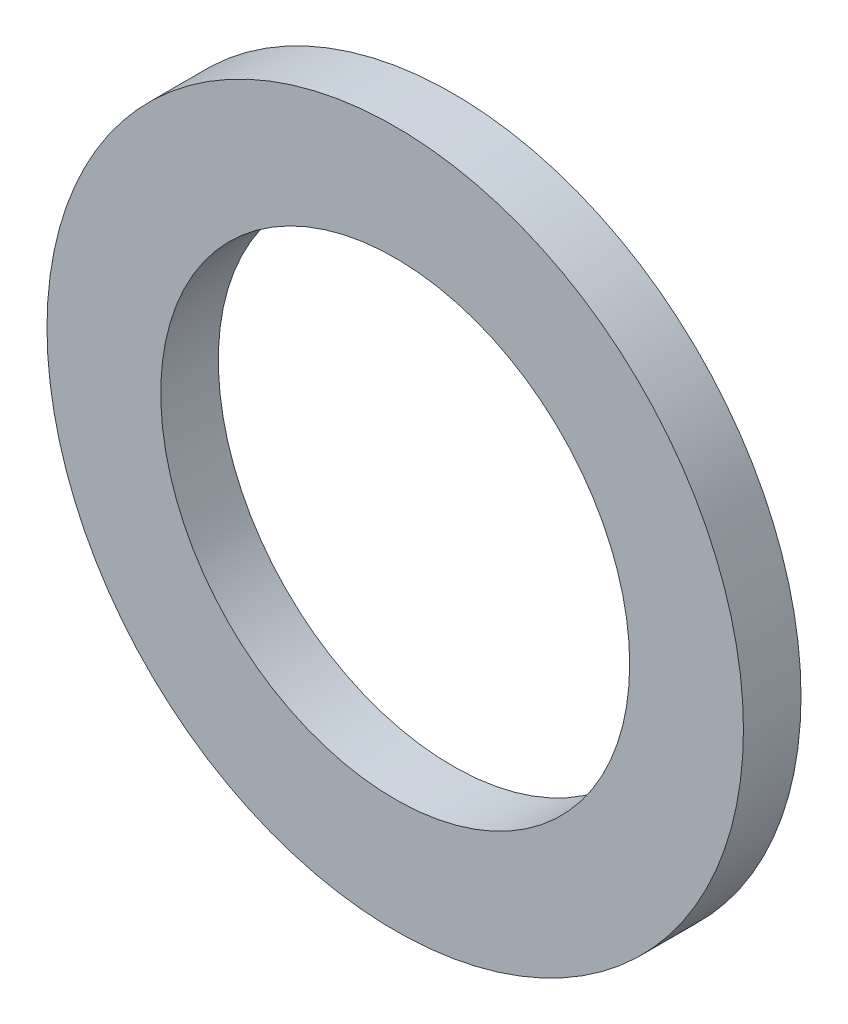
ISO-10303-21;
HEADER;
FILE_DESCRIPTION(('STEP AP214'),'2;1');
FILE_NAME('part.step','',(''),(''),'','','');
FILE_SCHEMA(('AUTOMOTIVE_DESIGN { 1 0 10303 214 1 1 1 1 }'));
ENDSEC;
DATA;
#1=APPLICATION_CONTEXT('core data for automotive mechanical design processes');
#2=APPLICATION_PROTOCOL_DEFINITION('international standard','automotive_design',2000,#1);
#3=PRODUCT_CONTEXT('',#1,'mechanical');
#4=PRODUCT('Part','Part','',(#3));
#5=PRODUCT_RELATED_PRODUCT_CATEGORY('part','',(#4));
#6=PRODUCT_DEFINITION_FORMATION('','',#4);
#7=PRODUCT_DEFINITION_CONTEXT('part definition',#1,'design');
#8=PRODUCT_DEFINITION('design','',#6,#7);
#9=PRODUCT_DEFINITION_SHAPE('','',#8);
#10=(LENGTH_UNIT() NAMED_UNIT(*) SI_UNIT(.MILLI.,.METRE.));
#11=(NAMED_UNIT(*) PLANE_ANGLE_UNIT() SI_UNIT($,.RADIAN.));
#12=(NAMED_UNIT(*) SI_UNIT($,.STERADIAN.) SOLID_ANGLE_UNIT());
#13=UNCERTAINTY_MEASURE_WITH_UNIT(LENGTH_MEASURE(1.E-05),#10,'distance_accuracy_value','');
#14=(GEOMETRIC_REPRESENTATION_CONTEXT(3) GLOBAL_UNCERTAINTY_ASSIGNED_CONTEXT((#13)) GLOBAL_UNIT_ASSIGNED_CONTEXT((#10,
#11,#12)) REPRESENTATION_CONTEXT('',''));
#15=CARTESIAN_POINT('',(0.,0.,0.));
#16=DIRECTION('',(0.,0.,1.));
#17=DIRECTION('',(1.,0.,0.));
#18=AXIS2_PLACEMENT_3D('',#15,#16,#17);
#19=CARTESIAN_POINT('',(0.,0.,1.5748));
#20=DIRECTION('',(0.,0.,1.));
#21=DIRECTION('',(1.,0.,0.));
#22=AXIS2_PLACEMENT_3D('',#19,#20,#21);
#23=PLANE('',#22);
#24=CARTESIAN_POINT('',(0.,0.,1.5748));
#25=DIRECTION('',(0.,0.,1.));
#26=DIRECTION('',(1.,0.,0.));
#27=AXIS2_PLACEMENT_3D('',#24,#25,#26);
#28=CIRCLE('',#27,9.525);
#29=CARTESIAN_POINT('',(9.525,0.,1.5748));
#30=VERTEX_POINT('',#29);
#31=EDGE_CURVE('E10',#30,#30,#28,.T.);
#32=ORIENTED_EDGE('',*,*,#31,.T.);
#33=EDGE_LOOP('',(#32));
#34=FACE_BOUND('',#33,.T.);
#35=CARTESIAN_POINT('',(0.,0.,1.5748));
#36=DIRECTION('',(0.,0.,1.));
#37=DIRECTION('',(1.,0.,0.));
#38=AXIS2_PLACEMENT_3D('',#35,#36,#37);
#39=CIRCLE('',#38,6.4135);
#40=CARTESIAN_POINT('',(6.4135,0.,1.5748));
#41=VERTEX_POINT('',#40);
#42=EDGE_CURVE('E41',#41,#41,#39,.T.);
#43=ORIENTED_EDGE('',*,*,#42,.F.);
#44=EDGE_LOOP('',(#43));
#45=FACE_BOUND('',#44,.T.);
#46=ADVANCED_FACE('F30',(#34,#45),#23,.T.);
#47=CARTESIAN_POINT('',(0.,0.,0.));
#48=DIRECTION('',(0.,0.,1.));
#49=DIRECTION('',(1.,0.,0.));
#50=AXIS2_PLACEMENT_3D('',#47,#48,#49);
#51=PLANE('',#50);
#52=CARTESIAN_POINT('',(0.,0.,0.));
#53=DIRECTION('',(0.,0.,1.));
#54=DIRECTION('',(1.,0.,0.));
#55=AXIS2_PLACEMENT_3D('',#52,#53,#54);
#56=CIRCLE('',#55,9.525);
#57=CARTESIAN_POINT('',(9.525,0.,0.));
#58=VERTEX_POINT('',#57);
#59=EDGE_CURVE('E34',#58,#58,#56,.T.);
#60=ORIENTED_EDGE('',*,*,#59,.F.);
#61=EDGE_LOOP('',(#60));
#62=FACE_BOUND('',#61,.T.);
#63=CARTESIAN_POINT('',(0.,0.,0.));
#64=DIRECTION('',(0.,0.,1.));
#65=DIRECTION('',(1.,0.,0.));
#66=AXIS2_PLACEMENT_3D('',#63,#64,#65);
#67=CIRCLE('',#66,6.4135);
#68=CARTESIAN_POINT('',(6.4135,0.,0.));
#69=VERTEX_POINT('',#68);
#70=EDGE_CURVE('E43',#69,#69,#67,.T.);
#71=ORIENTED_EDGE('',*,*,#70,.T.);
#72=EDGE_LOOP('',(#71));
#73=FACE_BOUND('',#72,.T.);
#74=ADVANCED_FACE('F53',(#62,#73),#51,.F.);
#75=CARTESIAN_POINT('',(0.,0.,1.5748));
#76=DIRECTION('',(0.,0.,-1.));
#77=DIRECTION('',(-1.,0.,0.));
#78=AXIS2_PLACEMENT_3D('',#75,#76,#77);
#79=CYLINDRICAL_SURFACE('',#78,9.525);
#80=ORIENTED_EDGE('',*,*,#31,.F.);
#81=EDGE_LOOP('',(#80));
#82=FACE_BOUND('',#81,.T.);
#83=ORIENTED_EDGE('',*,*,#59,.T.);
#84=EDGE_LOOP('',(#83));
#85=FACE_BOUND('',#84,.T.);
#86=ADVANCED_FACE('F32',(#82,#85),#79,.T.);
#87=CARTESIAN_POINT('',(0.,0.,1.5748));
#88=DIRECTION('',(0.,0.,-1.));
#89=DIRECTION('',(-1.,0.,0.));
#90=AXIS2_PLACEMENT_3D('',#87,#88,#89);
#91=CYLINDRICAL_SURFACE('',#90,6.4135);
#92=ORIENTED_EDGE('',*,*,#42,.T.);
#93=EDGE_LOOP('',(#92));
#94=FACE_BOUND('',#93,.T.);
#95=ORIENTED_EDGE('',*,*,#70,.F.);
#96=EDGE_LOOP('',(#95));
#97=FACE_BOUND('',#96,.T.);
#98=ADVANCED_FACE('F49',(#94,#97),#91,.F.);
#99=CLOSED_SHELL('',(#46,#74,#86,#98));
#100=MANIFOLD_SOLID_BREP('B2',#99);
#101=ADVANCED_BREP_SHAPE_REPRESENTATION('',(#18,#100),#14);
#102=SHAPE_DEFINITION_REPRESENTATION(#9,#101);
ENDSEC;
END-ISO-10303-21;
